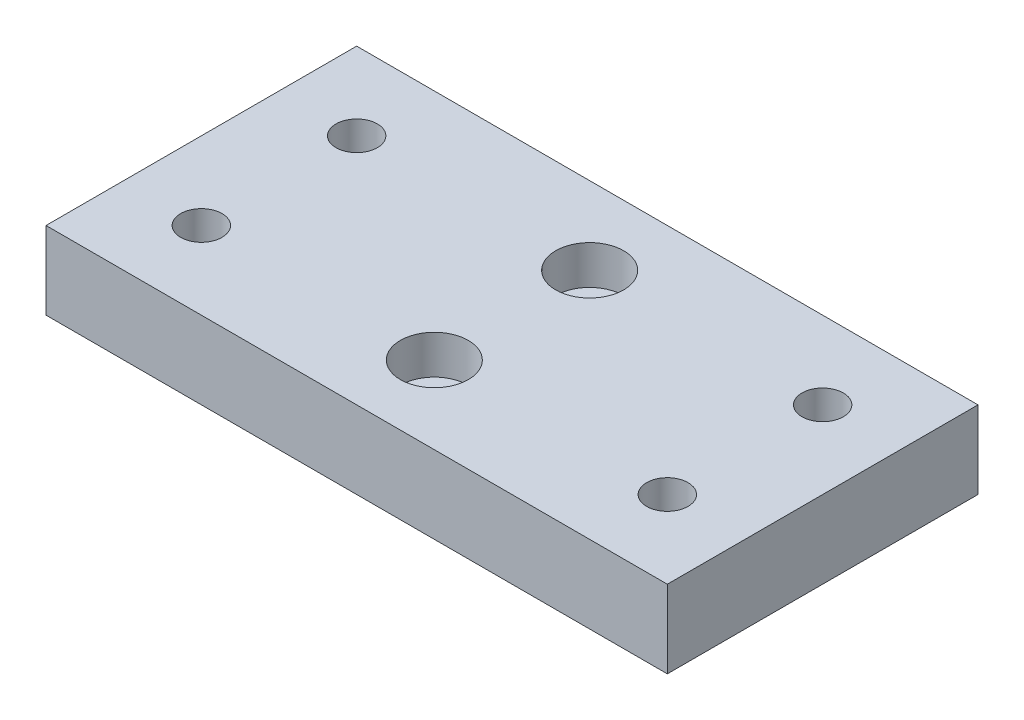
ISO-10303-21;
HEADER;
FILE_DESCRIPTION(('STEP AP214'),'2;1');
FILE_NAME('part.step','',(''),(''),'','','');
FILE_SCHEMA(('AUTOMOTIVE_DESIGN { 1 0 10303 214 1 1 1 1 }'));
ENDSEC;
DATA;
#1=APPLICATION_CONTEXT('core data for automotive mechanical design processes');
#2=APPLICATION_PROTOCOL_DEFINITION('international standard','automotive_design',2000,#1);
#3=PRODUCT_CONTEXT('',#1,'mechanical');
#4=PRODUCT('Part','Part','',(#3));
#5=PRODUCT_RELATED_PRODUCT_CATEGORY('part','',(#4));
#6=PRODUCT_DEFINITION_FORMATION('','',#4);
#7=PRODUCT_DEFINITION_CONTEXT('part definition',#1,'design');
#8=PRODUCT_DEFINITION('design','',#6,#7);
#9=PRODUCT_DEFINITION_SHAPE('','',#8);
#10=(LENGTH_UNIT() NAMED_UNIT(*) SI_UNIT(.MILLI.,.METRE.));
#11=(NAMED_UNIT(*) PLANE_ANGLE_UNIT() SI_UNIT($,.RADIAN.));
#12=(NAMED_UNIT(*) SI_UNIT($,.STERADIAN.) SOLID_ANGLE_UNIT());
#13=UNCERTAINTY_MEASURE_WITH_UNIT(LENGTH_MEASURE(1.E-05),#10,'distance_accuracy_value','');
#14=(GEOMETRIC_REPRESENTATION_CONTEXT(3) GLOBAL_UNCERTAINTY_ASSIGNED_CONTEXT((#13)) GLOBAL_UNIT_ASSIGNED_CONTEXT((#10,
#11,#12)) REPRESENTATION_CONTEXT('',''));
#15=CARTESIAN_POINT('',(0.,0.,0.));
#16=DIRECTION('',(0.,0.,1.));
#17=DIRECTION('',(1.,0.,0.));
#18=AXIS2_PLACEMENT_3D('',#15,#16,#17);
#19=CARTESIAN_POINT('',(0.,6.35,0.));
#20=DIRECTION('',(0.,-1.,0.));
#21=DIRECTION('',(0.,0.,-1.));
#22=AXIS2_PLACEMENT_3D('',#19,#20,#21);
#23=PLANE('',#22);
#24=CARTESIAN_POINT('',(0.,6.35,-12.7));
#25=DIRECTION('',(0.,1.,0.));
#26=DIRECTION('',(0.,0.,1.));
#27=AXIS2_PLACEMENT_3D('',#24,#25,#26);
#28=CIRCLE('',#27,5.55625);
#29=CARTESIAN_POINT('',(0.,6.35,-7.14375));
#30=VERTEX_POINT('',#29);
#31=EDGE_CURVE('E267',#30,#30,#28,.T.);
#32=ORIENTED_EDGE('',*,*,#31,.F.);
#33=EDGE_LOOP('',(#32));
#34=FACE_BOUND('',#33,.T.);
#35=CARTESIAN_POINT('',(0.,6.35,12.7));
#36=DIRECTION('',(0.,1.,0.));
#37=DIRECTION('',(0.,0.,1.));
#38=AXIS2_PLACEMENT_3D('',#35,#36,#37);
#39=CIRCLE('',#38,5.55625);
#40=CARTESIAN_POINT('',(0.,6.35,18.25625));
#41=VERTEX_POINT('',#40);
#42=EDGE_CURVE('E281',#41,#41,#39,.T.);
#43=ORIENTED_EDGE('',*,*,#42,.F.);
#44=EDGE_LOOP('',(#43));
#45=FACE_BOUND('',#44,.T.);
#46=CARTESIAN_POINT('',(38.1,6.35,-12.7));
#47=DIRECTION('',(0.,1.,0.));
#48=DIRECTION('',(0.,0.,1.));
#49=AXIS2_PLACEMENT_3D('',#46,#47,#48);
#50=CIRCLE('',#49,3.37819999999999);
#51=CARTESIAN_POINT('',(38.1,6.35,-9.32180000000001));
#52=VERTEX_POINT('',#51);
#53=EDGE_CURVE('E313',#52,#52,#50,.T.);
#54=ORIENTED_EDGE('',*,*,#53,.F.);
#55=EDGE_LOOP('',(#54));
#56=FACE_BOUND('',#55,.T.);
#57=DIRECTION('',(0.,0.,-1.));
#58=VECTOR('',#57,1.);
#59=CARTESIAN_POINT('',(-50.8,6.35,25.4));
#60=LINE('',#59,#58);
#61=CARTESIAN_POINT('',(-50.8,6.35,25.4));
#62=VERTEX_POINT('',#61);
#63=CARTESIAN_POINT('',(-50.8,6.35,-25.4));
#64=VERTEX_POINT('',#63);
#65=EDGE_CURVE('E103',#62,#64,#60,.T.);
#66=ORIENTED_EDGE('',*,*,#65,.F.);
#67=DIRECTION('',(1.,0.,0.));
#68=VECTOR('',#67,1.);
#69=CARTESIAN_POINT('',(-50.8,6.35,25.4));
#70=LINE('',#69,#68);
#71=CARTESIAN_POINT('',(50.8,6.35,25.4));
#72=VERTEX_POINT('',#71);
#73=EDGE_CURVE('E90',#62,#72,#70,.T.);
#74=ORIENTED_EDGE('',*,*,#73,.T.);
#75=DIRECTION('',(0.,0.,-1.));
#76=VECTOR('',#75,1.);
#77=CARTESIAN_POINT('',(50.8,6.35,25.4));
#78=LINE('',#77,#76);
#79=CARTESIAN_POINT('',(50.8,6.35,-25.4));
#80=VERTEX_POINT('',#79);
#81=EDGE_CURVE('E85',#72,#80,#78,.T.);
#82=ORIENTED_EDGE('',*,*,#81,.T.);
#83=DIRECTION('',(1.,0.,0.));
#84=VECTOR('',#83,1.);
#85=CARTESIAN_POINT('',(-50.8,6.35,-25.4));
#86=LINE('',#85,#84);
#87=EDGE_CURVE('E89',#64,#80,#86,.T.);
#88=ORIENTED_EDGE('',*,*,#87,.F.);
#89=EDGE_LOOP('',(#66,#74,#82,#88));
#90=FACE_BOUND('',#89,.T.);
#91=CARTESIAN_POINT('',(38.1,6.35,12.7));
#92=DIRECTION('',(0.,1.,0.));
#93=DIRECTION('',(0.,0.,1.));
#94=AXIS2_PLACEMENT_3D('',#91,#92,#93);
#95=CIRCLE('',#94,3.37819999999999);
#96=CARTESIAN_POINT('',(38.1,6.35,16.0782));
#97=VERTEX_POINT('',#96);
#98=EDGE_CURVE('E321',#97,#97,#95,.T.);
#99=ORIENTED_EDGE('',*,*,#98,.F.);
#100=EDGE_LOOP('',(#99));
#101=FACE_BOUND('',#100,.T.);
#102=CARTESIAN_POINT('',(-38.1,6.35,12.7));
#103=DIRECTION('',(0.,1.,0.));
#104=DIRECTION('',(0.,0.,1.));
#105=AXIS2_PLACEMENT_3D('',#102,#103,#104);
#106=CIRCLE('',#105,3.37819999999999);
#107=CARTESIAN_POINT('',(-38.1,6.35,16.0782));
#108=VERTEX_POINT('',#107);
#109=EDGE_CURVE('E305',#108,#108,#106,.T.);
#110=ORIENTED_EDGE('',*,*,#109,.F.);
#111=EDGE_LOOP('',(#110));
#112=FACE_BOUND('',#111,.T.);
#113=CARTESIAN_POINT('',(-38.1,6.35,-12.7));
#114=DIRECTION('',(0.,1.,0.));
#115=DIRECTION('',(0.,0.,1.));
#116=AXIS2_PLACEMENT_3D('',#113,#114,#115);
#117=CIRCLE('',#116,3.37819999999999);
#118=CARTESIAN_POINT('',(-38.1,6.35,-9.32180000000001));
#119=VERTEX_POINT('',#118);
#120=EDGE_CURVE('E297',#119,#119,#117,.T.);
#121=ORIENTED_EDGE('',*,*,#120,.F.);
#122=EDGE_LOOP('',(#121));
#123=FACE_BOUND('',#122,.T.);
#124=ADVANCED_FACE('F38',(#34,#45,#56,#90,#101,#112,#123),#23,.F.);
#125=CARTESIAN_POINT('',(-50.8,6.35,25.4));
#126=DIRECTION('',(-1.,0.,0.));
#127=DIRECTION('',(0.,0.,1.));
#128=AXIS2_PLACEMENT_3D('',#125,#126,#127);
#129=PLANE('',#128);
#130=DIRECTION('',(0.,0.,-1.));
#131=VECTOR('',#130,1.);
#132=CARTESIAN_POINT('',(-50.8,-6.35,25.4));
#133=LINE('',#132,#131);
#134=CARTESIAN_POINT('',(-50.8,-6.35,25.4));
#135=VERTEX_POINT('',#134);
#136=CARTESIAN_POINT('',(-50.8,-6.35,-25.4));
#137=VERTEX_POINT('',#136);
#138=EDGE_CURVE('E111',#135,#137,#133,.T.);
#139=ORIENTED_EDGE('',*,*,#138,.F.);
#140=DIRECTION('',(0.,-1.,0.));
#141=VECTOR('',#140,1.);
#142=CARTESIAN_POINT('',(-50.8,6.35,25.4));
#143=LINE('',#142,#141);
#144=EDGE_CURVE('E11',#62,#135,#143,.T.);
#145=ORIENTED_EDGE('',*,*,#144,.F.);
#146=ORIENTED_EDGE('',*,*,#65,.T.);
#147=DIRECTION('',(0.,-1.,0.));
#148=VECTOR('',#147,1.);
#149=CARTESIAN_POINT('',(-50.8,6.35,-25.4));
#150=LINE('',#149,#148);
#151=EDGE_CURVE('E42',#64,#137,#150,.T.);
#152=ORIENTED_EDGE('',*,*,#151,.T.);
#153=EDGE_LOOP('',(#139,#145,#146,#152));
#154=FACE_BOUND('',#153,.T.);
#155=ADVANCED_FACE('F40',(#154),#129,.T.);
#156=CARTESIAN_POINT('',(-50.8,6.35,25.4));
#157=DIRECTION('',(0.,0.,-1.));
#158=DIRECTION('',(-1.,0.,0.));
#159=AXIS2_PLACEMENT_3D('',#156,#157,#158);
#160=PLANE('',#159);
#161=DIRECTION('',(1.,0.,0.));
#162=VECTOR('',#161,1.);
#163=CARTESIAN_POINT('',(-50.8,-6.35,25.4));
#164=LINE('',#163,#162);
#165=CARTESIAN_POINT('',(50.8,-6.35,25.4));
#166=VERTEX_POINT('',#165);
#167=EDGE_CURVE('E73',#135,#166,#164,.T.);
#168=ORIENTED_EDGE('',*,*,#167,.T.);
#169=DIRECTION('',(0.,-1.,0.));
#170=VECTOR('',#169,1.);
#171=CARTESIAN_POINT('',(50.8,6.35,25.4));
#172=LINE('',#171,#170);
#173=EDGE_CURVE('E49',#72,#166,#172,.T.);
#174=ORIENTED_EDGE('',*,*,#173,.F.);
#175=ORIENTED_EDGE('',*,*,#73,.F.);
#176=ORIENTED_EDGE('',*,*,#144,.T.);
#177=EDGE_LOOP('',(#168,#174,#175,#176));
#178=FACE_BOUND('',#177,.T.);
#179=ADVANCED_FACE('F128',(#178),#160,.F.);
#180=CARTESIAN_POINT('',(50.8,6.35,25.4));
#181=DIRECTION('',(-1.,0.,0.));
#182=DIRECTION('',(0.,0.,1.));
#183=AXIS2_PLACEMENT_3D('',#180,#181,#182);
#184=PLANE('',#183);
#185=DIRECTION('',(0.,0.,-1.));
#186=VECTOR('',#185,1.);
#187=CARTESIAN_POINT('',(50.8,-6.35,25.4));
#188=LINE('',#187,#186);
#189=CARTESIAN_POINT('',(50.8,-6.35,-25.4));
#190=VERTEX_POINT('',#189);
#191=EDGE_CURVE('E98',#166,#190,#188,.T.);
#192=ORIENTED_EDGE('',*,*,#191,.T.);
#193=DIRECTION('',(0.,-1.,0.));
#194=VECTOR('',#193,1.);
#195=CARTESIAN_POINT('',(50.8,6.35,-25.4));
#196=LINE('',#195,#194);
#197=EDGE_CURVE('E95',#80,#190,#196,.T.);
#198=ORIENTED_EDGE('',*,*,#197,.F.);
#199=ORIENTED_EDGE('',*,*,#81,.F.);
#200=ORIENTED_EDGE('',*,*,#173,.T.);
#201=EDGE_LOOP('',(#192,#198,#199,#200));
#202=FACE_BOUND('',#201,.T.);
#203=ADVANCED_FACE('F96',(#202),#184,.F.);
#204=CARTESIAN_POINT('',(-50.8,6.35,-25.4));
#205=DIRECTION('',(0.,0.,-1.));
#206=DIRECTION('',(-1.,0.,0.));
#207=AXIS2_PLACEMENT_3D('',#204,#205,#206);
#208=PLANE('',#207);
#209=DIRECTION('',(1.,0.,0.));
#210=VECTOR('',#209,1.);
#211=CARTESIAN_POINT('',(-50.8,-6.35,-25.4));
#212=LINE('',#211,#210);
#213=EDGE_CURVE('E115',#137,#190,#212,.T.);
#214=ORIENTED_EDGE('',*,*,#213,.F.);
#215=ORIENTED_EDGE('',*,*,#151,.F.);
#216=ORIENTED_EDGE('',*,*,#87,.T.);
#217=ORIENTED_EDGE('',*,*,#197,.T.);
#218=EDGE_LOOP('',(#214,#215,#216,#217));
#219=FACE_BOUND('',#218,.T.);
#220=ADVANCED_FACE('F101',(#219),#208,.T.);
#221=CARTESIAN_POINT('',(0.,-6.35,0.));
#222=DIRECTION('',(0.,-1.,0.));
#223=DIRECTION('',(0.,0.,-1.));
#224=AXIS2_PLACEMENT_3D('',#221,#222,#223);
#225=PLANE('',#224);
#226=CARTESIAN_POINT('',(0.,-6.35,-12.7));
#227=DIRECTION('',(0.,1.,0.));
#228=DIRECTION('',(0.,0.,1.));
#229=AXIS2_PLACEMENT_3D('',#226,#227,#228);
#230=CIRCLE('',#229,3.3782);
#231=CARTESIAN_POINT('',(0.,-6.35,-9.3218));
#232=VERTEX_POINT('',#231);
#233=EDGE_CURVE('E277',#232,#232,#230,.T.);
#234=ORIENTED_EDGE('',*,*,#233,.T.);
#235=EDGE_LOOP('',(#234));
#236=FACE_BOUND('',#235,.T.);
#237=CARTESIAN_POINT('',(0.,-6.35,12.7));
#238=DIRECTION('',(0.,1.,0.));
#239=DIRECTION('',(0.,0.,1.));
#240=AXIS2_PLACEMENT_3D('',#237,#238,#239);
#241=CIRCLE('',#240,3.3782);
#242=CARTESIAN_POINT('',(0.,-6.35,16.0782));
#243=VERTEX_POINT('',#242);
#244=EDGE_CURVE('E293',#243,#243,#241,.T.);
#245=ORIENTED_EDGE('',*,*,#244,.T.);
#246=EDGE_LOOP('',(#245));
#247=FACE_BOUND('',#246,.T.);
#248=CARTESIAN_POINT('',(-38.1,-6.35,-12.7));
#249=DIRECTION('',(0.,-1.,0.));
#250=DIRECTION('',(0.,0.,-1.));
#251=AXIS2_PLACEMENT_3D('',#248,#249,#250);
#252=CIRCLE('',#251,3.37819999999999);
#253=CARTESIAN_POINT('',(-38.1,-6.35,-16.0782));
#254=VERTEX_POINT('',#253);
#255=EDGE_CURVE('E301',#254,#254,#252,.T.);
#256=ORIENTED_EDGE('',*,*,#255,.F.);
#257=EDGE_LOOP('',(#256));
#258=FACE_BOUND('',#257,.T.);
#259=CARTESIAN_POINT('',(-38.1,-6.35,12.7));
#260=DIRECTION('',(0.,-1.,0.));
#261=DIRECTION('',(0.,0.,-1.));
#262=AXIS2_PLACEMENT_3D('',#259,#260,#261);
#263=CIRCLE('',#262,3.37819999999999);
#264=CARTESIAN_POINT('',(-38.1,-6.35,9.3218));
#265=VERTEX_POINT('',#264);
#266=EDGE_CURVE('E309',#265,#265,#263,.T.);
#267=ORIENTED_EDGE('',*,*,#266,.F.);
#268=EDGE_LOOP('',(#267));
#269=FACE_BOUND('',#268,.T.);
#270=CARTESIAN_POINT('',(38.1,-6.35,-12.7));
#271=DIRECTION('',(0.,-1.,0.));
#272=DIRECTION('',(0.,0.,-1.));
#273=AXIS2_PLACEMENT_3D('',#270,#271,#272);
#274=CIRCLE('',#273,3.37819999999999);
#275=CARTESIAN_POINT('',(38.1,-6.35,-16.0782));
#276=VERTEX_POINT('',#275);
#277=EDGE_CURVE('E317',#276,#276,#274,.T.);
#278=ORIENTED_EDGE('',*,*,#277,.F.);
#279=EDGE_LOOP('',(#278));
#280=FACE_BOUND('',#279,.T.);
#281=CARTESIAN_POINT('',(38.1,-6.35,12.7));
#282=DIRECTION('',(0.,-1.,0.));
#283=DIRECTION('',(0.,0.,-1.));
#284=AXIS2_PLACEMENT_3D('',#281,#282,#283);
#285=CIRCLE('',#284,3.37819999999999);
#286=CARTESIAN_POINT('',(38.1,-6.35,9.3218));
#287=VERTEX_POINT('',#286);
#288=EDGE_CURVE('E116',#287,#287,#285,.T.);
#289=ORIENTED_EDGE('',*,*,#288,.F.);
#290=EDGE_LOOP('',(#289));
#291=FACE_BOUND('',#290,.T.);
#292=ORIENTED_EDGE('',*,*,#138,.T.);
#293=ORIENTED_EDGE('',*,*,#213,.T.);
#294=ORIENTED_EDGE('',*,*,#191,.F.);
#295=ORIENTED_EDGE('',*,*,#167,.F.);
#296=EDGE_LOOP('',(#292,#293,#294,#295));
#297=FACE_BOUND('',#296,.T.);
#298=ADVANCED_FACE('F125',(#236,#247,#258,#269,#280,#291,#297),#225,.T.);
#299=CARTESIAN_POINT('',(38.1,6.35,12.7));
#300=DIRECTION('',(0.,1.,0.));
#301=DIRECTION('',(0.,0.,1.));
#302=AXIS2_PLACEMENT_3D('',#299,#300,#301);
#303=CYLINDRICAL_SURFACE('',#302,3.37819999999999);
#304=ORIENTED_EDGE('',*,*,#98,.T.);
#305=EDGE_LOOP('',(#304));
#306=FACE_BOUND('',#305,.T.);
#307=ORIENTED_EDGE('',*,*,#288,.T.);
#308=EDGE_LOOP('',(#307));
#309=FACE_BOUND('',#308,.T.);
#310=ADVANCED_FACE('F144',(#306,#309),#303,.F.);
#311=CARTESIAN_POINT('',(38.1,6.35,-12.7));
#312=DIRECTION('',(0.,1.,0.));
#313=DIRECTION('',(0.,0.,1.));
#314=AXIS2_PLACEMENT_3D('',#311,#312,#313);
#315=CYLINDRICAL_SURFACE('',#314,3.37819999999999);
#316=ORIENTED_EDGE('',*,*,#53,.T.);
#317=EDGE_LOOP('',(#316));
#318=FACE_BOUND('',#317,.T.);
#319=ORIENTED_EDGE('',*,*,#277,.T.);
#320=EDGE_LOOP('',(#319));
#321=FACE_BOUND('',#320,.T.);
#322=ADVANCED_FACE('F172',(#318,#321),#315,.F.);
#323=CARTESIAN_POINT('',(-38.1,6.35,12.7));
#324=DIRECTION('',(0.,1.,0.));
#325=DIRECTION('',(0.,0.,1.));
#326=AXIS2_PLACEMENT_3D('',#323,#324,#325);
#327=CYLINDRICAL_SURFACE('',#326,3.37819999999999);
#328=ORIENTED_EDGE('',*,*,#109,.T.);
#329=EDGE_LOOP('',(#328));
#330=FACE_BOUND('',#329,.T.);
#331=ORIENTED_EDGE('',*,*,#266,.T.);
#332=EDGE_LOOP('',(#331));
#333=FACE_BOUND('',#332,.T.);
#334=ADVANCED_FACE('F178',(#330,#333),#327,.F.);
#335=CARTESIAN_POINT('',(-38.1,6.35,-12.7));
#336=DIRECTION('',(0.,1.,0.));
#337=DIRECTION('',(0.,0.,1.));
#338=AXIS2_PLACEMENT_3D('',#335,#336,#337);
#339=CYLINDRICAL_SURFACE('',#338,3.37819999999999);
#340=ORIENTED_EDGE('',*,*,#120,.T.);
#341=EDGE_LOOP('',(#340));
#342=FACE_BOUND('',#341,.T.);
#343=ORIENTED_EDGE('',*,*,#255,.T.);
#344=EDGE_LOOP('',(#343));
#345=FACE_BOUND('',#344,.T.);
#346=ADVANCED_FACE('F185',(#342,#345),#339,.F.);
#347=CARTESIAN_POINT('',(0.,6.35,12.7));
#348=DIRECTION('',(0.,1.,0.));
#349=DIRECTION('',(0.,0.,1.));
#350=AXIS2_PLACEMENT_3D('',#347,#348,#349);
#351=CYLINDRICAL_SURFACE('',#350,3.3782);
#352=ORIENTED_EDGE('',*,*,#244,.F.);
#353=EDGE_LOOP('',(#352));
#354=FACE_BOUND('',#353,.T.);
#355=CARTESIAN_POINT('',(0.,0.,12.7));
#356=DIRECTION('',(0.,1.,0.));
#357=DIRECTION('',(0.,0.,1.));
#358=AXIS2_PLACEMENT_3D('',#355,#356,#357);
#359=CIRCLE('',#358,3.3782);
#360=CARTESIAN_POINT('',(0.,0.,16.0782));
#361=VERTEX_POINT('',#360);
#362=EDGE_CURVE('E289',#361,#361,#359,.T.);
#363=ORIENTED_EDGE('',*,*,#362,.T.);
#364=EDGE_LOOP('',(#363));
#365=FACE_BOUND('',#364,.T.);
#366=ADVANCED_FACE('F192',(#354,#365),#351,.F.);
#367=CARTESIAN_POINT('',(3.3782,0.,12.7));
#368=DIRECTION('',(0.,-1.,0.));
#369=DIRECTION('',(0.,0.,-1.));
#370=AXIS2_PLACEMENT_3D('',#367,#368,#369);
#371=PLANE('',#370);
#372=ORIENTED_EDGE('',*,*,#362,.F.);
#373=EDGE_LOOP('',(#372));
#374=FACE_BOUND('',#373,.T.);
#375=CARTESIAN_POINT('',(0.,0.,12.7));
#376=DIRECTION('',(0.,1.,0.));
#377=DIRECTION('',(0.,0.,1.));
#378=AXIS2_PLACEMENT_3D('',#375,#376,#377);
#379=CIRCLE('',#378,5.55625);
#380=CARTESIAN_POINT('',(0.,0.,18.25625));
#381=VERTEX_POINT('',#380);
#382=EDGE_CURVE('E285',#381,#381,#379,.T.);
#383=ORIENTED_EDGE('',*,*,#382,.T.);
#384=EDGE_LOOP('',(#383));
#385=FACE_BOUND('',#384,.T.);
#386=ADVANCED_FACE('F199',(#374,#385),#371,.F.);
#387=CARTESIAN_POINT('',(0.,6.35,12.7));
#388=DIRECTION('',(0.,1.,0.));
#389=DIRECTION('',(0.,0.,1.));
#390=AXIS2_PLACEMENT_3D('',#387,#388,#389);
#391=CYLINDRICAL_SURFACE('',#390,5.55625);
#392=ORIENTED_EDGE('',*,*,#382,.F.);
#393=EDGE_LOOP('',(#392));
#394=FACE_BOUND('',#393,.T.);
#395=ORIENTED_EDGE('',*,*,#42,.T.);
#396=EDGE_LOOP('',(#395));
#397=FACE_BOUND('',#396,.T.);
#398=ADVANCED_FACE('F207',(#394,#397),#391,.F.);
#399=CARTESIAN_POINT('',(0.,6.35,-12.7));
#400=DIRECTION('',(0.,1.,0.));
#401=DIRECTION('',(0.,0.,1.));
#402=AXIS2_PLACEMENT_3D('',#399,#400,#401);
#403=CYLINDRICAL_SURFACE('',#402,3.3782);
#404=ORIENTED_EDGE('',*,*,#233,.F.);
#405=EDGE_LOOP('',(#404));
#406=FACE_BOUND('',#405,.T.);
#407=CARTESIAN_POINT('',(0.,0.,-12.7));
#408=DIRECTION('',(0.,1.,0.));
#409=DIRECTION('',(0.,0.,1.));
#410=AXIS2_PLACEMENT_3D('',#407,#408,#409);
#411=CIRCLE('',#410,3.3782);
#412=CARTESIAN_POINT('',(0.,0.,-9.3218));
#413=VERTEX_POINT('',#412);
#414=EDGE_CURVE('E271',#413,#413,#411,.T.);
#415=ORIENTED_EDGE('',*,*,#414,.T.);
#416=EDGE_LOOP('',(#415));
#417=FACE_BOUND('',#416,.T.);
#418=ADVANCED_FACE('F215',(#406,#417),#403,.F.);
#419=CARTESIAN_POINT('',(3.3782,0.,-12.7));
#420=DIRECTION('',(0.,-1.,0.));
#421=DIRECTION('',(0.,0.,-1.));
#422=AXIS2_PLACEMENT_3D('',#419,#420,#421);
#423=PLANE('',#422);
#424=ORIENTED_EDGE('',*,*,#414,.F.);
#425=EDGE_LOOP('',(#424));
#426=FACE_BOUND('',#425,.T.);
#427=CARTESIAN_POINT('',(0.,0.,-12.7));
#428=DIRECTION('',(0.,1.,0.));
#429=DIRECTION('',(0.,0.,1.));
#430=AXIS2_PLACEMENT_3D('',#427,#428,#429);
#431=CIRCLE('',#430,5.55625);
#432=CARTESIAN_POINT('',(0.,0.,-7.14375));
#433=VERTEX_POINT('',#432);
#434=EDGE_CURVE('E265',#433,#433,#431,.T.);
#435=ORIENTED_EDGE('',*,*,#434,.T.);
#436=EDGE_LOOP('',(#435));
#437=FACE_BOUND('',#436,.T.);
#438=ADVANCED_FACE('F223',(#426,#437),#423,.F.);
#439=CARTESIAN_POINT('',(0.,6.35,-12.7));
#440=DIRECTION('',(0.,1.,0.));
#441=DIRECTION('',(0.,0.,1.));
#442=AXIS2_PLACEMENT_3D('',#439,#440,#441);
#443=CYLINDRICAL_SURFACE('',#442,5.55625);
#444=ORIENTED_EDGE('',*,*,#434,.F.);
#445=EDGE_LOOP('',(#444));
#446=FACE_BOUND('',#445,.T.);
#447=ORIENTED_EDGE('',*,*,#31,.T.);
#448=EDGE_LOOP('',(#447));
#449=FACE_BOUND('',#448,.T.);
#450=ADVANCED_FACE('F231',(#446,#449),#443,.F.);
#451=CLOSED_SHELL('',(#124,#155,#179,#203,#220,#298,#310,#322,#334,#346,#366,#386,#398,#418,
#438,#450));
#452=MANIFOLD_SOLID_BREP('B2',#451);
#453=ADVANCED_BREP_SHAPE_REPRESENTATION('',(#18,#452),#14);
#454=SHAPE_DEFINITION_REPRESENTATION(#9,#453);
ENDSEC;
END-ISO-10303-21;
